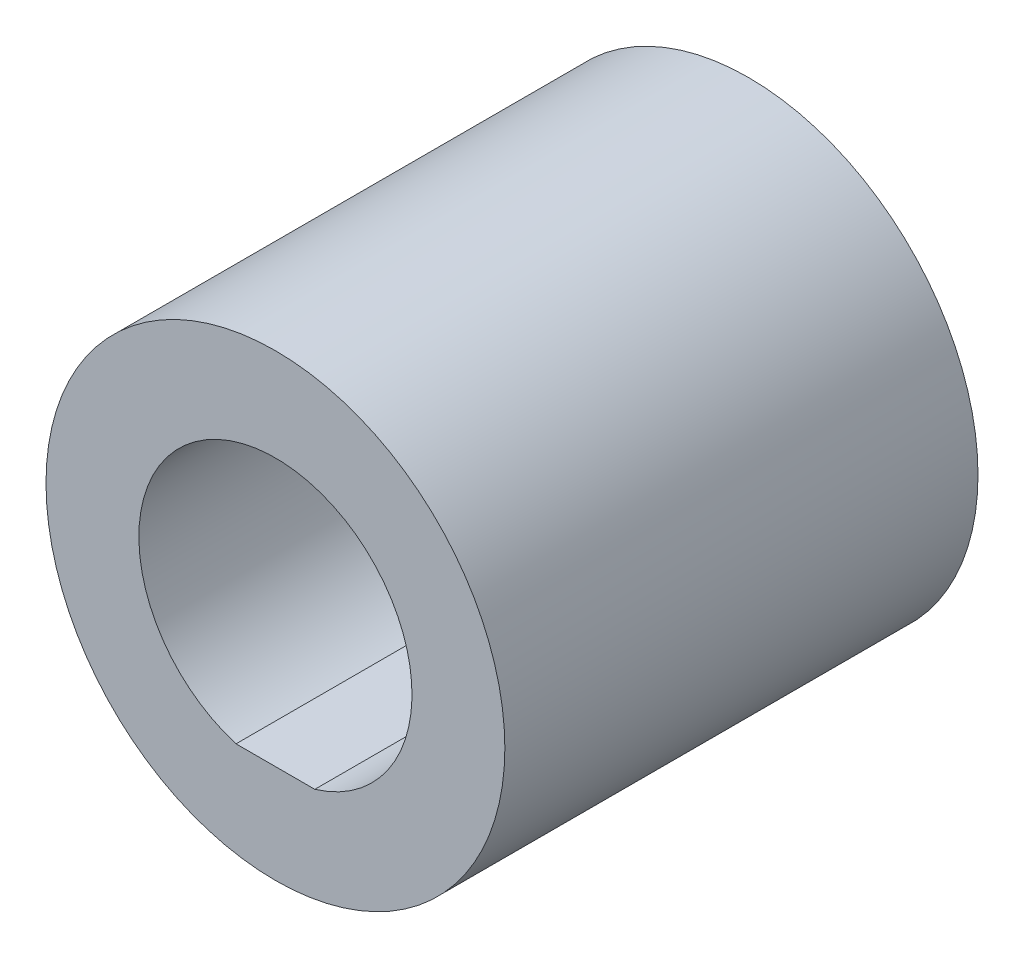
ISO-10303-21;
HEADER;
FILE_DESCRIPTION(('STEP AP214'),'2;1');
FILE_NAME('part.step','',(''),(''),'','','');
FILE_SCHEMA(('AUTOMOTIVE_DESIGN { 1 0 10303 214 1 1 1 1 }'));
ENDSEC;
DATA;
#1=APPLICATION_CONTEXT('core data for automotive mechanical design processes');
#2=APPLICATION_PROTOCOL_DEFINITION('international standard','automotive_design',2000,#1);
#3=PRODUCT_CONTEXT('',#1,'mechanical');
#4=PRODUCT('Part','Part','',(#3));
#5=PRODUCT_RELATED_PRODUCT_CATEGORY('part','',(#4));
#6=PRODUCT_DEFINITION_FORMATION('','',#4);
#7=PRODUCT_DEFINITION_CONTEXT('part definition',#1,'design');
#8=PRODUCT_DEFINITION('design','',#6,#7);
#9=PRODUCT_DEFINITION_SHAPE('','',#8);
#10=(LENGTH_UNIT() NAMED_UNIT(*) SI_UNIT(.MILLI.,.METRE.));
#11=(NAMED_UNIT(*) PLANE_ANGLE_UNIT() SI_UNIT($,.RADIAN.));
#12=(NAMED_UNIT(*) SI_UNIT($,.STERADIAN.) SOLID_ANGLE_UNIT());
#13=UNCERTAINTY_MEASURE_WITH_UNIT(LENGTH_MEASURE(1.E-05),#10,'distance_accuracy_value','');
#14=(GEOMETRIC_REPRESENTATION_CONTEXT(3) GLOBAL_UNCERTAINTY_ASSIGNED_CONTEXT((#13)) GLOBAL_UNIT_ASSIGNED_CONTEXT((#10,
#11,#12)) REPRESENTATION_CONTEXT('',''));
#15=CARTESIAN_POINT('',(0.,0.,0.));
#16=DIRECTION('',(0.,0.,1.));
#17=DIRECTION('',(1.,0.,0.));
#18=AXIS2_PLACEMENT_3D('',#15,#16,#17);
#19=CARTESIAN_POINT('',(0.,0.,4.064));
#20=DIRECTION('',(0.,0.,1.));
#21=DIRECTION('',(0.,-1.,0.));
#22=AXIS2_PLACEMENT_3D('',#19,#20,#21);
#23=CYLINDRICAL_SURFACE('',#22,3.175);
#24=CARTESIAN_POINT('',(0.,0.,11.));
#25=DIRECTION('',(0.,0.,1.));
#26=DIRECTION('',(0.,-1.,0.));
#27=AXIS2_PLACEMENT_3D('',#24,#25,#26);
#28=CIRCLE('',#27,3.175);
#29=CARTESIAN_POINT('',(-0.915983078446321,-3.04,11.));
#30=VERTEX_POINT('',#29);
#31=CARTESIAN_POINT('',(0.915983078446321,-3.04,11.));
#32=VERTEX_POINT('',#31);
#33=EDGE_CURVE('E51',#30,#32,#28,.F.);
#34=ORIENTED_EDGE('',*,*,#33,.F.);
#35=DIRECTION('',(0.,0.,1.));
#36=VECTOR('',#35,1.);
#37=CARTESIAN_POINT('',(-0.915983078446321,-3.04,4.064));
#38=LINE('',#37,#36);
#39=CARTESIAN_POINT('',(-0.915983078446321,-3.04,4.064));
#40=VERTEX_POINT('',#39);
#41=EDGE_CURVE('E58',#40,#30,#38,.T.);
#42=ORIENTED_EDGE('',*,*,#41,.F.);
#43=CARTESIAN_POINT('',(0.,0.,4.064));
#44=DIRECTION('',(0.,0.,1.));
#45=DIRECTION('',(0.,-1.,0.));
#46=AXIS2_PLACEMENT_3D('',#43,#44,#45);
#47=CIRCLE('',#46,3.175);
#48=CARTESIAN_POINT('',(0.915983078446321,-3.04,4.064));
#49=VERTEX_POINT('',#48);
#50=EDGE_CURVE('E84',#49,#40,#47,.T.);
#51=ORIENTED_EDGE('',*,*,#50,.F.);
#52=DIRECTION('',(0.,0.,1.));
#53=VECTOR('',#52,1.);
#54=CARTESIAN_POINT('',(0.915983078446321,-3.04,4.064));
#55=LINE('',#54,#53);
#56=EDGE_CURVE('E67',#32,#49,#55,.F.);
#57=ORIENTED_EDGE('',*,*,#56,.F.);
#58=EDGE_LOOP('',(#34,#42,#51,#57));
#59=FACE_BOUND('',#58,.T.);
#60=ADVANCED_FACE('F38',(#59),#23,.F.);
#61=CARTESIAN_POINT('',(0.,0.,12.7));
#62=DIRECTION('',(0.,0.,-1.));
#63=DIRECTION('',(0.,1.,0.));
#64=AXIS2_PLACEMENT_3D('',#61,#62,#63);
#65=CYLINDRICAL_SURFACE('',#64,5.334);
#66=CARTESIAN_POINT('',(0.,0.,0.));
#67=DIRECTION('',(0.,0.,-1.));
#68=DIRECTION('',(0.,1.,0.));
#69=AXIS2_PLACEMENT_3D('',#66,#67,#68);
#70=CIRCLE('',#69,5.334);
#71=CARTESIAN_POINT('',(0.,5.334,0.));
#72=VERTEX_POINT('',#71);
#73=EDGE_CURVE('E46',#72,#72,#70,.F.);
#74=ORIENTED_EDGE('',*,*,#73,.T.);
#75=EDGE_LOOP('',(#74));
#76=FACE_BOUND('',#75,.T.);
#77=CARTESIAN_POINT('',(0.,0.,11.));
#78=DIRECTION('',(0.,0.,1.));
#79=DIRECTION('',(0.,-1.,0.));
#80=AXIS2_PLACEMENT_3D('',#77,#78,#79);
#81=CIRCLE('',#80,5.334);
#82=CARTESIAN_POINT('',(0.,-5.334,11.));
#83=VERTEX_POINT('',#82);
#84=EDGE_CURVE('E69',#83,#83,#81,.F.);
#85=ORIENTED_EDGE('',*,*,#84,.T.);
#86=EDGE_LOOP('',(#85));
#87=FACE_BOUND('',#86,.T.);
#88=ADVANCED_FACE('F107',(#76,#87),#65,.T.);
#89=CARTESIAN_POINT('',(-2.05603988288165,-3.04,-11.0228302833962));
#90=DIRECTION('',(0.,-1.,0.));
#91=DIRECTION('',(1.,0.,0.));
#92=AXIS2_PLACEMENT_3D('',#89,#90,#91);
#93=PLANE('',#92);
#94=DIRECTION('',(-1.,0.,0.));
#95=VECTOR('',#94,1.);
#96=CARTESIAN_POINT('',(-2.05603988288165,-3.04,11.));
#97=LINE('',#96,#95);
#98=EDGE_CURVE('E12',#32,#30,#97,.T.);
#99=ORIENTED_EDGE('',*,*,#98,.F.);
#100=ORIENTED_EDGE('',*,*,#56,.T.);
#101=DIRECTION('',(-1.,0.,0.));
#102=VECTOR('',#101,1.);
#103=CARTESIAN_POINT('',(-2.05603988288165,-3.04,4.064));
#104=LINE('',#103,#102);
#105=EDGE_CURVE('E74',#49,#40,#104,.T.);
#106=ORIENTED_EDGE('',*,*,#105,.T.);
#107=ORIENTED_EDGE('',*,*,#41,.T.);
#108=EDGE_LOOP('',(#99,#100,#106,#107));
#109=FACE_BOUND('',#108,.T.);
#110=ADVANCED_FACE('F72',(#109),#93,.F.);
#111=CARTESIAN_POINT('',(0.,0.,4.064));
#112=DIRECTION('',(0.,0.,1.));
#113=DIRECTION('',(0.,-1.,0.));
#114=AXIS2_PLACEMENT_3D('',#111,#112,#113);
#115=PLANE('',#114);
#116=CARTESIAN_POINT('',(0.,0.,4.064));
#117=DIRECTION('',(0.,0.,1.));
#118=DIRECTION('',(0.,-1.,0.));
#119=AXIS2_PLACEMENT_3D('',#116,#117,#118);
#120=CIRCLE('',#119,1.524);
#121=CARTESIAN_POINT('',(0.,-1.524,4.064));
#122=VERTEX_POINT('',#121);
#123=EDGE_CURVE('E76',#122,#122,#120,.F.);
#124=ORIENTED_EDGE('',*,*,#123,.T.);
#125=EDGE_LOOP('',(#124));
#126=FACE_BOUND('',#125,.T.);
#127=ORIENTED_EDGE('',*,*,#50,.T.);
#128=ORIENTED_EDGE('',*,*,#105,.F.);
#129=EDGE_LOOP('',(#127,#128));
#130=FACE_BOUND('',#129,.T.);
#131=ADVANCED_FACE('F88',(#126,#130),#115,.T.);
#132=CARTESIAN_POINT('',(0.,0.,0.));
#133=DIRECTION('',(0.,0.,1.));
#134=DIRECTION('',(0.,-1.,0.));
#135=AXIS2_PLACEMENT_3D('',#132,#133,#134);
#136=CYLINDRICAL_SURFACE('',#135,1.524);
#137=ORIENTED_EDGE('',*,*,#123,.F.);
#138=EDGE_LOOP('',(#137));
#139=FACE_BOUND('',#138,.T.);
#140=CARTESIAN_POINT('',(0.,0.,3.048));
#141=DIRECTION('',(0.,0.,-1.));
#142=DIRECTION('',(0.,1.,0.));
#143=AXIS2_PLACEMENT_3D('',#140,#141,#142);
#144=CIRCLE('',#143,1.524);
#145=CARTESIAN_POINT('',(0.,1.524,3.048));
#146=VERTEX_POINT('',#145);
#147=EDGE_CURVE('E78',#146,#146,#144,.F.);
#148=ORIENTED_EDGE('',*,*,#147,.F.);
#149=EDGE_LOOP('',(#148));
#150=FACE_BOUND('',#149,.T.);
#151=ADVANCED_FACE('F40',(#139,#150),#136,.F.);
#152=CARTESIAN_POINT('',(0.,0.,0.));
#153=DIRECTION('',(0.,0.,1.));
#154=DIRECTION('',(0.,-1.,0.));
#155=AXIS2_PLACEMENT_3D('',#152,#153,#154);
#156=PLANE('',#155);
#157=CARTESIAN_POINT('',(0.,0.,0.));
#158=DIRECTION('',(0.,0.,-1.));
#159=DIRECTION('',(0.,1.,0.));
#160=AXIS2_PLACEMENT_3D('',#157,#158,#159);
#161=CIRCLE('',#160,2.5);
#162=CARTESIAN_POINT('',(0.,2.5,0.));
#163=VERTEX_POINT('',#162);
#164=EDGE_CURVE('E68',#163,#163,#161,.T.);
#165=ORIENTED_EDGE('',*,*,#164,.F.);
#166=EDGE_LOOP('',(#165));
#167=FACE_BOUND('',#166,.T.);
#168=ORIENTED_EDGE('',*,*,#73,.F.);
#169=EDGE_LOOP('',(#168));
#170=FACE_BOUND('',#169,.T.);
#171=ADVANCED_FACE('F93',(#167,#170),#156,.F.);
#172=CARTESIAN_POINT('',(0.,0.,3.048));
#173=DIRECTION('',(0.,0.,-1.));
#174=DIRECTION('',(0.,1.,0.));
#175=AXIS2_PLACEMENT_3D('',#172,#173,#174);
#176=PLANE('',#175);
#177=CARTESIAN_POINT('',(0.,0.,3.048));
#178=DIRECTION('',(0.,0.,-1.));
#179=DIRECTION('',(0.,1.,0.));
#180=AXIS2_PLACEMENT_3D('',#177,#178,#179);
#181=CIRCLE('',#180,2.5);
#182=CARTESIAN_POINT('',(0.,2.5,3.048));
#183=VERTEX_POINT('',#182);
#184=EDGE_CURVE('E98',#183,#183,#181,.F.);
#185=ORIENTED_EDGE('',*,*,#184,.F.);
#186=EDGE_LOOP('',(#185));
#187=FACE_BOUND('',#186,.T.);
#188=ORIENTED_EDGE('',*,*,#147,.T.);
#189=EDGE_LOOP('',(#188));
#190=FACE_BOUND('',#189,.T.);
#191=ADVANCED_FACE('F94',(#187,#190),#176,.T.);
#192=CARTESIAN_POINT('',(0.,0.,10.1190678118655));
#193=DIRECTION('',(0.,0.,-1.));
#194=DIRECTION('',(0.,1.,0.));
#195=AXIS2_PLACEMENT_3D('',#192,#193,#194);
#196=CYLINDRICAL_SURFACE('',#195,2.5);
#197=CARTESIAN_POINT('',(0.,2.5,3.048));
#198=CARTESIAN_POINT('',(0.,2.5,3.01625));
#199=CARTESIAN_POINT('',(0.,2.5,2.9845));
#200=CARTESIAN_POINT('',(0.,2.5,2.921));
#201=CARTESIAN_POINT('',(0.,2.5,2.88925));
#202=CARTESIAN_POINT('',(0.,2.5,2.82575));
#203=CARTESIAN_POINT('',(0.,2.5,2.794));
#204=CARTESIAN_POINT('',(0.,2.5,2.7305));
#205=CARTESIAN_POINT('',(0.,2.5,2.69875));
#206=CARTESIAN_POINT('',(0.,2.5,2.63525));
#207=CARTESIAN_POINT('',(0.,2.5,2.6035));
#208=CARTESIAN_POINT('',(0.,2.5,2.54));
#209=CARTESIAN_POINT('',(0.,2.5,2.50825));
#210=CARTESIAN_POINT('',(0.,2.5,2.44475));
#211=CARTESIAN_POINT('',(0.,2.5,2.413));
#212=CARTESIAN_POINT('',(0.,2.5,2.3495));
#213=CARTESIAN_POINT('',(0.,2.5,2.31775));
#214=CARTESIAN_POINT('',(0.,2.5,2.25425));
#215=CARTESIAN_POINT('',(0.,2.5,2.2225));
#216=CARTESIAN_POINT('',(0.,2.5,2.159));
#217=CARTESIAN_POINT('',(0.,2.5,2.12725));
#218=CARTESIAN_POINT('',(0.,2.5,2.06375));
#219=CARTESIAN_POINT('',(0.,2.5,2.032));
#220=CARTESIAN_POINT('',(0.,2.5,1.9685));
#221=CARTESIAN_POINT('',(0.,2.5,1.93675));
#222=CARTESIAN_POINT('',(0.,2.5,1.87325));
#223=CARTESIAN_POINT('',(0.,2.5,1.8415));
#224=CARTESIAN_POINT('',(0.,2.5,1.778));
#225=CARTESIAN_POINT('',(0.,2.5,1.74625));
#226=CARTESIAN_POINT('',(0.,2.5,1.68275));
#227=CARTESIAN_POINT('',(0.,2.5,1.651));
#228=CARTESIAN_POINT('',(0.,2.5,1.5875));
#229=CARTESIAN_POINT('',(0.,2.5,1.55575));
#230=CARTESIAN_POINT('',(0.,2.5,1.49225));
#231=CARTESIAN_POINT('',(0.,2.5,1.4605));
#232=CARTESIAN_POINT('',(0.,2.5,1.397));
#233=CARTESIAN_POINT('',(0.,2.5,1.36525));
#234=CARTESIAN_POINT('',(0.,2.5,1.30175));
#235=CARTESIAN_POINT('',(0.,2.5,1.27));
#236=CARTESIAN_POINT('',(0.,2.5,1.2065));
#237=CARTESIAN_POINT('',(0.,2.5,1.17475));
#238=CARTESIAN_POINT('',(0.,2.5,1.11125));
#239=CARTESIAN_POINT('',(0.,2.5,1.0795));
#240=CARTESIAN_POINT('',(0.,2.5,1.016));
#241=CARTESIAN_POINT('',(0.,2.5,0.98425));
#242=CARTESIAN_POINT('',(0.,2.5,0.92075));
#243=CARTESIAN_POINT('',(0.,2.5,0.889));
#244=CARTESIAN_POINT('',(0.,2.5,0.8255));
#245=CARTESIAN_POINT('',(0.,2.5,0.793750000000001));
#246=CARTESIAN_POINT('',(0.,2.5,0.730250000000001));
#247=CARTESIAN_POINT('',(0.,2.5,0.698500000000001));
#248=CARTESIAN_POINT('',(0.,2.5,0.635000000000001));
#249=CARTESIAN_POINT('',(0.,2.5,0.603250000000001));
#250=CARTESIAN_POINT('',(0.,2.5,0.539750000000001));
#251=CARTESIAN_POINT('',(0.,2.5,0.508000000000001));
#252=CARTESIAN_POINT('',(0.,2.5,0.4445));
#253=CARTESIAN_POINT('',(0.,2.5,0.41275));
#254=CARTESIAN_POINT('',(0.,2.5,0.34925));
#255=CARTESIAN_POINT('',(0.,2.5,0.317500000000001));
#256=CARTESIAN_POINT('',(0.,2.5,0.254000000000001));
#257=CARTESIAN_POINT('',(0.,2.5,0.22225));
#258=CARTESIAN_POINT('',(0.,2.5,0.15875));
#259=CARTESIAN_POINT('',(0.,2.5,0.127));
#260=CARTESIAN_POINT('',(0.,2.5,0.0634999999999999));
#261=CARTESIAN_POINT('',(0.,2.5,0.03175));
#262=CARTESIAN_POINT('',(0.,2.5,0.));
#263=B_SPLINE_CURVE_WITH_KNOTS('',3,(#197,#198,#199,#200,#201,#202,#203,#204,#205,#206,#207,
#208,#209,#210,#211,#212,#213,#214,#215,#216,#217,#218,#219,#220,#221,#222,#223,#224,#225,#226,
#227,#228,#229,#230,#231,#232,#233,#234,#235,#236,#237,#238,#239,#240,#241,#242,#243,#244,#245,
#246,#247,#248,#249,#250,#251,#252,#253,#254,#255,#256,#257,#258,#259,#260,#261,#262),
.UNSPECIFIED.,.F.,.F.,(4,2,2,2,2,2,2,2,2,2,2,2,2,2,2,2,2,2,2,2,2,2,2,2,2,2,2,2,2,2,2,2,4),(0.,
0.0952499999999998,0.1905,0.28575,0.381,0.47625,0.571500000000001,0.666750000000001,0.762,
0.85725,0.952499999999999,1.04775,1.143,1.23825,1.3335,1.42875,1.524,1.61925,1.7145,1.80975,
1.905,2.00025,2.0955,2.19075,2.286,2.38125,2.4765,2.57175,2.667,2.76225,2.8575,2.95275,3.048),.UNSPECIFIED.);
#264=EDGE_CURVE('BSEAM110',#183,#163,#263,.T.);
#265=ORIENTED_EDGE('',*,*,#184,.T.);
#266=ORIENTED_EDGE('',*,*,#164,.T.);
#267=ORIENTED_EDGE('',*,*,#264,.T.);
#268=ORIENTED_EDGE('',*,*,#264,.F.);
#269=EDGE_LOOP('',(#265,#267,#266,#268));
#270=FACE_BOUND('',#269,.T.);
#271=ADVANCED_FACE('F110',(#270),#196,.F.);
#272=CARTESIAN_POINT('',(0.,0.,11.));
#273=DIRECTION('',(0.,0.,1.));
#274=DIRECTION('',(0.,-1.,0.));
#275=AXIS2_PLACEMENT_3D('',#272,#273,#274);
#276=PLANE('',#275);
#277=ORIENTED_EDGE('',*,*,#84,.F.);
#278=EDGE_LOOP('',(#277));
#279=FACE_BOUND('',#278,.T.);
#280=ORIENTED_EDGE('',*,*,#33,.T.);
#281=ORIENTED_EDGE('',*,*,#98,.T.);
#282=EDGE_LOOP('',(#280,#281));
#283=FACE_BOUND('',#282,.T.);
#284=ADVANCED_FACE('F64',(#279,#283),#276,.T.);
#285=CLOSED_SHELL('',(#60,#88,#110,#131,#151,#171,#191,#271,#284));
#286=MANIFOLD_SOLID_BREP('B2',#285);
#287=ADVANCED_BREP_SHAPE_REPRESENTATION('',(#18,#286),#14);
#288=SHAPE_DEFINITION_REPRESENTATION(#9,#287);
ENDSEC;
END-ISO-10303-21;
